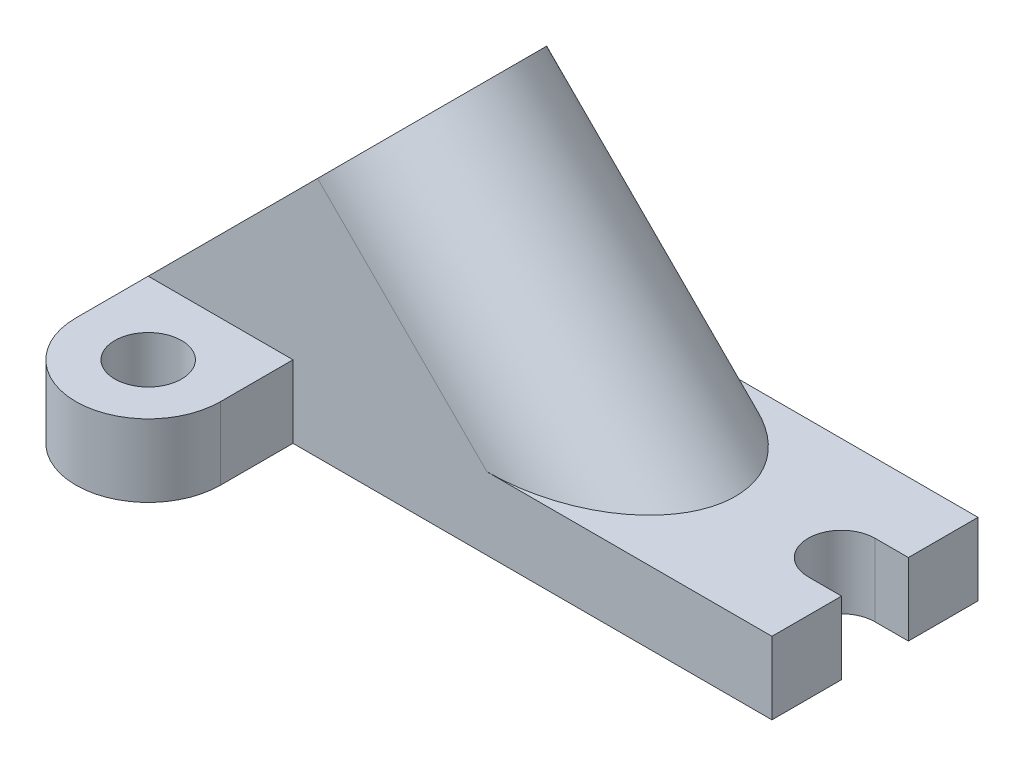
ISO-10303-21;
HEADER;
FILE_DESCRIPTION(('STEP AP214'),'2;1');
FILE_NAME('part.step','',(''),(''),'','','');
FILE_SCHEMA(('AUTOMOTIVE_DESIGN { 1 0 10303 214 1 1 1 1 }'));
ENDSEC;
DATA;
#1=APPLICATION_CONTEXT('core data for automotive mechanical design processes');
#2=APPLICATION_PROTOCOL_DEFINITION('international standard','automotive_design',2000,#1);
#3=PRODUCT_CONTEXT('',#1,'mechanical');
#4=PRODUCT('Part','Part','',(#3));
#5=PRODUCT_RELATED_PRODUCT_CATEGORY('part','',(#4));
#6=PRODUCT_DEFINITION_FORMATION('','',#4);
#7=PRODUCT_DEFINITION_CONTEXT('part definition',#1,'design');
#8=PRODUCT_DEFINITION('design','',#6,#7);
#9=PRODUCT_DEFINITION_SHAPE('','',#8);
#10=(LENGTH_UNIT() NAMED_UNIT(*) SI_UNIT(.MILLI.,.METRE.));
#11=(NAMED_UNIT(*) PLANE_ANGLE_UNIT() SI_UNIT($,.RADIAN.));
#12=(NAMED_UNIT(*) SI_UNIT($,.STERADIAN.) SOLID_ANGLE_UNIT());
#13=UNCERTAINTY_MEASURE_WITH_UNIT(LENGTH_MEASURE(1.E-05),#10,'distance_accuracy_value','');
#14=(GEOMETRIC_REPRESENTATION_CONTEXT(3) GLOBAL_UNCERTAINTY_ASSIGNED_CONTEXT((#13)) GLOBAL_UNIT_ASSIGNED_CONTEXT((#10,
#11,#12)) REPRESENTATION_CONTEXT('',''));
#15=CARTESIAN_POINT('',(0.,0.,0.));
#16=DIRECTION('',(0.,0.,1.));
#17=DIRECTION('',(1.,0.,0.));
#18=AXIS2_PLACEMENT_3D('',#15,#16,#17);
#19=CARTESIAN_POINT('',(0.,13.,-31.5));
#20=DIRECTION('',(0.,1.,0.));
#21=DIRECTION('',(0.,0.,1.));
#22=AXIS2_PLACEMENT_3D('',#19,#20,#21);
#23=PLANE('',#22);
#24=CARTESIAN_POINT('',(47.8111831820432,13.,0.));
#25=DIRECTION('',(0.,1.,0.));
#26=DIRECTION('',(-1.,0.,0.));
#27=AXIS2_PLACEMENT_3D('',#24,#25,#26);
#28=ELLIPSE('',#27,26.1629509039023,18.5);
#29=CARTESIAN_POINT('',(47.8111831820432,13.,18.5));
#30=VERTEX_POINT('',#29);
#31=CARTESIAN_POINT('',(47.8111831820432,13.,-18.5));
#32=VERTEX_POINT('',#31);
#33=EDGE_CURVE('E56',#30,#32,#28,.T.);
#34=ORIENTED_EDGE('',*,*,#33,.F.);
#35=DIRECTION('',(-1.,0.,0.));
#36=VECTOR('',#35,1.);
#37=CARTESIAN_POINT('',(99.,13.,18.5));
#38=LINE('',#37,#36);
#39=CARTESIAN_POINT('',(99.,13.,18.5));
#40=VERTEX_POINT('',#39);
#41=EDGE_CURVE('E205',#40,#30,#38,.T.);
#42=ORIENTED_EDGE('',*,*,#41,.F.);
#43=DIRECTION('',(0.,0.,-1.));
#44=VECTOR('',#43,1.);
#45=CARTESIAN_POINT('',(99.,13.,18.5));
#46=LINE('',#45,#44);
#47=CARTESIAN_POINT('',(99.,13.,6.));
#48=VERTEX_POINT('',#47);
#49=EDGE_CURVE('E197',#40,#48,#46,.T.);
#50=ORIENTED_EDGE('',*,*,#49,.T.);
#51=DIRECTION('',(1.,0.,0.));
#52=VECTOR('',#51,1.);
#53=CARTESIAN_POINT('',(105.,13.,6.));
#54=LINE('',#53,#52);
#55=CARTESIAN_POINT('',(93.,13.,6.));
#56=VERTEX_POINT('',#55);
#57=EDGE_CURVE('E204',#56,#48,#54,.T.);
#58=ORIENTED_EDGE('',*,*,#57,.F.);
#59=CARTESIAN_POINT('',(93.,13.,0.));
#60=DIRECTION('',(0.,1.,0.));
#61=DIRECTION('',(0.,0.,1.));
#62=AXIS2_PLACEMENT_3D('',#59,#60,#61);
#63=CIRCLE('',#62,6.);
#64=CARTESIAN_POINT('',(93.,13.,-6.));
#65=VERTEX_POINT('',#64);
#66=EDGE_CURVE('E287',#65,#56,#63,.T.);
#67=ORIENTED_EDGE('',*,*,#66,.F.);
#68=DIRECTION('',(-1.,0.,0.));
#69=VECTOR('',#68,1.);
#70=CARTESIAN_POINT('',(105.,13.,-6.));
#71=LINE('',#70,#69);
#72=CARTESIAN_POINT('',(99.,13.,-6.));
#73=VERTEX_POINT('',#72);
#74=EDGE_CURVE('E284',#73,#65,#71,.T.);
#75=ORIENTED_EDGE('',*,*,#74,.F.);
#76=CARTESIAN_POINT('',(99.,13.,-18.5));
#77=VERTEX_POINT('',#76);
#78=EDGE_CURVE('E208',#73,#77,#46,.T.);
#79=ORIENTED_EDGE('',*,*,#78,.T.);
#80=DIRECTION('',(-1.,0.,0.));
#81=VECTOR('',#80,1.);
#82=CARTESIAN_POINT('',(99.,13.,-18.5));
#83=LINE('',#82,#81);
#84=EDGE_CURVE('E161',#77,#32,#83,.T.);
#85=ORIENTED_EDGE('',*,*,#84,.T.);
#86=EDGE_LOOP('',(#34,#42,#50,#58,#67,#75,#79,#85));
#87=FACE_BOUND('',#86,.T.);
#88=ADVANCED_FACE('F33',(#87),#23,.T.);
#89=DIRECTION('',(1.,0.,0.));
#90=VECTOR('',#89,1.);
#91=CARTESIAN_POINT('',(0.,13.,18.5));
#92=LINE('',#91,#90);
#93=CARTESIAN_POINT('',(-13.,13.,18.5));
#94=VERTEX_POINT('',#93);
#95=CARTESIAN_POINT('',(13.,13.,18.5));
#96=VERTEX_POINT('',#95);
#97=EDGE_CURVE('E252',#94,#96,#92,.T.);
#98=ORIENTED_EDGE('',*,*,#97,.F.);
#99=DIRECTION('',(0.,0.,1.));
#100=VECTOR('',#99,1.);
#101=CARTESIAN_POINT('',(-13.,13.,-31.5));
#102=LINE('',#101,#100);
#103=CARTESIAN_POINT('',(-13.,13.,31.5));
#104=VERTEX_POINT('',#103);
#105=EDGE_CURVE('E225',#94,#104,#102,.T.);
#106=ORIENTED_EDGE('',*,*,#105,.T.);
#107=CARTESIAN_POINT('',(0.,13.,31.5));
#108=DIRECTION('',(0.,1.,0.));
#109=DIRECTION('',(0.,0.,1.));
#110=AXIS2_PLACEMENT_3D('',#107,#108,#109);
#111=CIRCLE('',#110,13.);
#112=CARTESIAN_POINT('',(13.,13.,31.5));
#113=VERTEX_POINT('',#112);
#114=EDGE_CURVE('E228',#104,#113,#111,.T.);
#115=ORIENTED_EDGE('',*,*,#114,.T.);
#116=DIRECTION('',(0.,0.,-1.));
#117=VECTOR('',#116,1.);
#118=CARTESIAN_POINT('',(13.,13.,-31.5));
#119=LINE('',#118,#117);
#120=EDGE_CURVE('E179',#113,#96,#119,.T.);
#121=ORIENTED_EDGE('',*,*,#120,.T.);
#122=EDGE_LOOP('',(#98,#106,#115,#121));
#123=FACE_BOUND('',#122,.T.);
#124=CARTESIAN_POINT('',(0.,13.,31.5));
#125=DIRECTION('',(0.,1.,0.));
#126=DIRECTION('',(0.,0.,1.));
#127=AXIS2_PLACEMENT_3D('',#124,#125,#126);
#128=CIRCLE('',#127,6.);
#129=CARTESIAN_POINT('',(0.,13.,25.5));
#130=VERTEX_POINT('',#129);
#131=EDGE_CURVE('E211',#130,#130,#128,.T.);
#132=ORIENTED_EDGE('',*,*,#131,.F.);
#133=EDGE_LOOP('',(#132));
#134=FACE_BOUND('',#133,.T.);
#135=ADVANCED_FACE('F329',(#123,#134),#23,.T.);
#136=CARTESIAN_POINT('',(99.,0.,18.5));
#137=DIRECTION('',(-1.,0.,0.));
#138=DIRECTION('',(0.,0.,1.));
#139=AXIS2_PLACEMENT_3D('',#136,#137,#138);
#140=PLANE('',#139);
#141=DIRECTION('',(0.,0.,-1.));
#142=VECTOR('',#141,1.);
#143=CARTESIAN_POINT('',(99.,0.,18.5));
#144=LINE('',#143,#142);
#145=CARTESIAN_POINT('',(99.,0.,18.5));
#146=VERTEX_POINT('',#145);
#147=CARTESIAN_POINT('',(99.,0.,6.));
#148=VERTEX_POINT('',#147);
#149=EDGE_CURVE('E199',#146,#148,#144,.T.);
#150=ORIENTED_EDGE('',*,*,#149,.T.);
#151=DIRECTION('',(0.,1.,0.));
#152=VECTOR('',#151,1.);
#153=CARTESIAN_POINT('',(99.,0.,6.));
#154=LINE('',#153,#152);
#155=EDGE_CURVE('E41',#148,#48,#154,.T.);
#156=ORIENTED_EDGE('',*,*,#155,.T.);
#157=ORIENTED_EDGE('',*,*,#49,.F.);
#158=DIRECTION('',(0.,1.,0.));
#159=VECTOR('',#158,1.);
#160=CARTESIAN_POINT('',(99.,0.,18.5));
#161=LINE('',#160,#159);
#162=EDGE_CURVE('E152',#146,#40,#161,.T.);
#163=ORIENTED_EDGE('',*,*,#162,.F.);
#164=EDGE_LOOP('',(#150,#156,#157,#163));
#165=FACE_BOUND('',#164,.T.);
#166=ADVANCED_FACE('F195',(#165),#140,.F.);
#167=CARTESIAN_POINT('',(13.,13.,-31.5));
#168=DIRECTION('',(-1.,0.,0.));
#169=DIRECTION('',(0.,0.,1.));
#170=AXIS2_PLACEMENT_3D('',#167,#168,#169);
#171=PLANE('',#170);
#172=DIRECTION('',(0.,-1.,0.));
#173=VECTOR('',#172,1.);
#174=CARTESIAN_POINT('',(13.,13.,-18.5));
#175=LINE('',#174,#173);
#176=CARTESIAN_POINT('',(13.,13.,-18.5));
#177=VERTEX_POINT('',#176);
#178=CARTESIAN_POINT('',(13.,0.,-18.5));
#179=VERTEX_POINT('',#178);
#180=EDGE_CURVE('E144',#177,#179,#175,.T.);
#181=ORIENTED_EDGE('',*,*,#180,.T.);
#182=DIRECTION('',(0.,0.,-1.));
#183=VECTOR('',#182,1.);
#184=CARTESIAN_POINT('',(13.,0.,-31.5));
#185=LINE('',#184,#183);
#186=CARTESIAN_POINT('',(13.,0.,-31.5));
#187=VERTEX_POINT('',#186);
#188=EDGE_CURVE('E158',#179,#187,#185,.T.);
#189=ORIENTED_EDGE('',*,*,#188,.T.);
#190=DIRECTION('',(0.,-1.,0.));
#191=VECTOR('',#190,1.);
#192=CARTESIAN_POINT('',(13.,13.,-31.5));
#193=LINE('',#192,#191);
#194=CARTESIAN_POINT('',(13.,13.,-31.5));
#195=VERTEX_POINT('',#194);
#196=EDGE_CURVE('E176',#195,#187,#193,.T.);
#197=ORIENTED_EDGE('',*,*,#196,.F.);
#198=EDGE_CURVE('E160',#177,#195,#119,.T.);
#199=ORIENTED_EDGE('',*,*,#198,.F.);
#200=EDGE_LOOP('',(#181,#189,#197,#199));
#201=FACE_BOUND('',#200,.T.);
#202=ADVANCED_FACE('F156',(#201),#171,.F.);
#203=DIRECTION('',(-1.,0.,0.));
#204=VECTOR('',#203,1.);
#205=CARTESIAN_POINT('',(0.,13.,-18.5));
#206=LINE('',#205,#204);
#207=CARTESIAN_POINT('',(-13.,13.,-18.5));
#208=VERTEX_POINT('',#207);
#209=EDGE_CURVE('E282',#177,#208,#206,.T.);
#210=ORIENTED_EDGE('',*,*,#209,.F.);
#211=ORIENTED_EDGE('',*,*,#198,.T.);
#212=CARTESIAN_POINT('',(0.,13.,-31.5));
#213=DIRECTION('',(0.,1.,0.));
#214=DIRECTION('',(0.,0.,1.));
#215=AXIS2_PLACEMENT_3D('',#212,#213,#214);
#216=CIRCLE('',#215,13.);
#217=CARTESIAN_POINT('',(-13.,13.,-31.5));
#218=VERTEX_POINT('',#217);
#219=EDGE_CURVE('E171',#195,#218,#216,.T.);
#220=ORIENTED_EDGE('',*,*,#219,.T.);
#221=EDGE_CURVE('E226',#218,#208,#102,.T.);
#222=ORIENTED_EDGE('',*,*,#221,.T.);
#223=EDGE_LOOP('',(#210,#211,#220,#222));
#224=FACE_BOUND('',#223,.T.);
#225=CARTESIAN_POINT('',(0.,13.,-31.5));
#226=DIRECTION('',(0.,1.,0.));
#227=DIRECTION('',(0.,0.,1.));
#228=AXIS2_PLACEMENT_3D('',#225,#226,#227);
#229=CIRCLE('',#228,6.);
#230=CARTESIAN_POINT('',(0.,13.,-37.5));
#231=VERTEX_POINT('',#230);
#232=EDGE_CURVE('E218',#231,#231,#229,.T.);
#233=ORIENTED_EDGE('',*,*,#232,.F.);
#234=EDGE_LOOP('',(#233));
#235=FACE_BOUND('',#234,.T.);
#236=ADVANCED_FACE('F331',(#224,#235),#23,.T.);
#237=CARTESIAN_POINT('',(0.,0.,-31.5));
#238=DIRECTION('',(0.,1.,0.));
#239=DIRECTION('',(0.,0.,1.));
#240=AXIS2_PLACEMENT_3D('',#237,#238,#239);
#241=PLANE('',#240);
#242=CARTESIAN_POINT('',(60.8111831820433,0.,0.));
#243=DIRECTION('',(0.,1.,0.));
#244=DIRECTION('',(-1.,0.,0.));
#245=AXIS2_PLACEMENT_3D('',#242,#243,#244);
#246=ELLIPSE('',#245,11.3137084989848,7.99999999999999);
#247=CARTESIAN_POINT('',(49.4974746830585,0.,0.));
#248=VERTEX_POINT('',#247);
#249=EDGE_CURVE('E308',#248,#248,#246,.T.);
#250=ORIENTED_EDGE('',*,*,#249,.T.);
#251=EDGE_LOOP('',(#250));
#252=FACE_BOUND('',#251,.T.);
#253=CARTESIAN_POINT('',(0.,0.,-31.5));
#254=DIRECTION('',(0.,1.,0.));
#255=DIRECTION('',(0.,0.,1.));
#256=AXIS2_PLACEMENT_3D('',#253,#254,#255);
#257=CIRCLE('',#256,6.);
#258=CARTESIAN_POINT('',(0.,0.,-37.5));
#259=VERTEX_POINT('',#258);
#260=EDGE_CURVE('E216',#259,#259,#257,.T.);
#261=ORIENTED_EDGE('',*,*,#260,.T.);
#262=EDGE_LOOP('',(#261));
#263=FACE_BOUND('',#262,.T.);
#264=CARTESIAN_POINT('',(0.,0.,31.5));
#265=DIRECTION('',(0.,1.,0.));
#266=DIRECTION('',(0.,0.,1.));
#267=AXIS2_PLACEMENT_3D('',#264,#265,#266);
#268=CIRCLE('',#267,6.);
#269=CARTESIAN_POINT('',(0.,0.,25.5));
#270=VERTEX_POINT('',#269);
#271=EDGE_CURVE('E207',#270,#270,#268,.T.);
#272=ORIENTED_EDGE('',*,*,#271,.T.);
#273=EDGE_LOOP('',(#272));
#274=FACE_BOUND('',#273,.T.);
#275=DIRECTION('',(1.,0.,0.));
#276=VECTOR('',#275,1.);
#277=CARTESIAN_POINT('',(13.,0.,18.5));
#278=LINE('',#277,#276);
#279=CARTESIAN_POINT('',(13.,0.,18.5));
#280=VERTEX_POINT('',#279);
#281=EDGE_CURVE('E241',#280,#146,#278,.T.);
#282=ORIENTED_EDGE('',*,*,#281,.F.);
#283=CARTESIAN_POINT('',(13.,0.,31.5));
#284=VERTEX_POINT('',#283);
#285=EDGE_CURVE('E167',#284,#280,#185,.T.);
#286=ORIENTED_EDGE('',*,*,#285,.F.);
#287=CARTESIAN_POINT('',(0.,0.,31.5));
#288=DIRECTION('',(0.,1.,0.));
#289=DIRECTION('',(0.,0.,1.));
#290=AXIS2_PLACEMENT_3D('',#287,#288,#289);
#291=CIRCLE('',#290,13.);
#292=CARTESIAN_POINT('',(-13.,0.,31.5));
#293=VERTEX_POINT('',#292);
#294=EDGE_CURVE('E168',#293,#284,#291,.T.);
#295=ORIENTED_EDGE('',*,*,#294,.F.);
#296=DIRECTION('',(0.,0.,1.));
#297=VECTOR('',#296,1.);
#298=CARTESIAN_POINT('',(-13.,0.,-31.5));
#299=LINE('',#298,#297);
#300=CARTESIAN_POINT('',(-13.,0.,-31.5));
#301=VERTEX_POINT('',#300);
#302=EDGE_CURVE('E172',#301,#293,#299,.T.);
#303=ORIENTED_EDGE('',*,*,#302,.F.);
#304=CARTESIAN_POINT('',(0.,0.,-31.5));
#305=DIRECTION('',(0.,1.,0.));
#306=DIRECTION('',(0.,0.,1.));
#307=AXIS2_PLACEMENT_3D('',#304,#305,#306);
#308=CIRCLE('',#307,13.);
#309=EDGE_CURVE('E166',#187,#301,#308,.T.);
#310=ORIENTED_EDGE('',*,*,#309,.F.);
#311=ORIENTED_EDGE('',*,*,#188,.F.);
#312=DIRECTION('',(1.,0.,0.));
#313=VECTOR('',#312,1.);
#314=CARTESIAN_POINT('',(13.,0.,-18.5));
#315=LINE('',#314,#313);
#316=CARTESIAN_POINT('',(99.,0.,-18.5));
#317=VERTEX_POINT('',#316);
#318=EDGE_CURVE('E140',#179,#317,#315,.T.);
#319=ORIENTED_EDGE('',*,*,#318,.T.);
#320=CARTESIAN_POINT('',(99.,0.,-5.99999999999999));
#321=VERTEX_POINT('',#320);
#322=EDGE_CURVE('E254',#321,#317,#144,.T.);
#323=ORIENTED_EDGE('',*,*,#322,.F.);
#324=DIRECTION('',(-1.,0.,0.));
#325=VECTOR('',#324,1.);
#326=CARTESIAN_POINT('',(0.,0.,-6.));
#327=LINE('',#326,#325);
#328=CARTESIAN_POINT('',(93.,0.,-6.));
#329=VERTEX_POINT('',#328);
#330=EDGE_CURVE('E294',#321,#329,#327,.T.);
#331=ORIENTED_EDGE('',*,*,#330,.T.);
#332=CARTESIAN_POINT('',(93.,0.,0.));
#333=DIRECTION('',(0.,1.,0.));
#334=DIRECTION('',(0.,0.,1.));
#335=AXIS2_PLACEMENT_3D('',#332,#333,#334);
#336=CIRCLE('',#335,6.);
#337=CARTESIAN_POINT('',(93.,0.,6.));
#338=VERTEX_POINT('',#337);
#339=EDGE_CURVE('E11',#329,#338,#336,.T.);
#340=ORIENTED_EDGE('',*,*,#339,.T.);
#341=DIRECTION('',(1.,0.,0.));
#342=VECTOR('',#341,1.);
#343=CARTESIAN_POINT('',(0.,0.,6.00000000000001));
#344=LINE('',#343,#342);
#345=EDGE_CURVE('E260',#338,#148,#344,.T.);
#346=ORIENTED_EDGE('',*,*,#345,.T.);
#347=ORIENTED_EDGE('',*,*,#149,.F.);
#348=EDGE_LOOP('',(#282,#286,#295,#303,#310,#311,#319,#323,#331,#340,#346,#347));
#349=FACE_BOUND('',#348,.T.);
#350=ADVANCED_FACE('F164',(#252,#263,#274,#349),#241,.F.);
#351=CARTESIAN_POINT('',(0.,13.,-31.5));
#352=DIRECTION('',(0.,-1.,0.));
#353=DIRECTION('',(0.,0.,-1.));
#354=AXIS2_PLACEMENT_3D('',#351,#352,#353);
#355=CYLINDRICAL_SURFACE('',#354,13.);
#356=ORIENTED_EDGE('',*,*,#309,.T.);
#357=DIRECTION('',(0.,-1.,0.));
#358=VECTOR('',#357,1.);
#359=CARTESIAN_POINT('',(-13.,13.,-31.5));
#360=LINE('',#359,#358);
#361=EDGE_CURVE('E185',#218,#301,#360,.T.);
#362=ORIENTED_EDGE('',*,*,#361,.F.);
#363=ORIENTED_EDGE('',*,*,#219,.F.);
#364=ORIENTED_EDGE('',*,*,#196,.T.);
#365=EDGE_LOOP('',(#356,#362,#363,#364));
#366=FACE_BOUND('',#365,.T.);
#367=ADVANCED_FACE('F35',(#366),#355,.T.);
#368=CARTESIAN_POINT('',(-13.,13.,-31.5));
#369=DIRECTION('',(1.,0.,0.));
#370=DIRECTION('',(0.,0.,-1.));
#371=AXIS2_PLACEMENT_3D('',#368,#369,#370);
#372=PLANE('',#371);
#373=ORIENTED_EDGE('',*,*,#302,.T.);
#374=DIRECTION('',(0.,-1.,0.));
#375=VECTOR('',#374,1.);
#376=CARTESIAN_POINT('',(-13.,13.,31.5));
#377=LINE('',#376,#375);
#378=EDGE_CURVE('E182',#104,#293,#377,.T.);
#379=ORIENTED_EDGE('',*,*,#378,.F.);
#380=ORIENTED_EDGE('',*,*,#105,.F.);
#381=DIRECTION('',(0.,0.,1.));
#382=VECTOR('',#381,1.);
#383=CARTESIAN_POINT('',(-13.,13.,18.5));
#384=LINE('',#383,#382);
#385=EDGE_CURVE('E48',#208,#94,#384,.T.);
#386=ORIENTED_EDGE('',*,*,#385,.F.);
#387=ORIENTED_EDGE('',*,*,#221,.F.);
#388=ORIENTED_EDGE('',*,*,#361,.T.);
#389=EDGE_LOOP('',(#373,#379,#380,#386,#387,#388));
#390=FACE_BOUND('',#389,.T.);
#391=ADVANCED_FACE('F233',(#390),#372,.F.);
#392=CARTESIAN_POINT('',(0.,13.,31.5));
#393=DIRECTION('',(0.,-1.,0.));
#394=DIRECTION('',(0.,0.,-1.));
#395=AXIS2_PLACEMENT_3D('',#392,#393,#394);
#396=CYLINDRICAL_SURFACE('',#395,13.);
#397=ORIENTED_EDGE('',*,*,#294,.T.);
#398=DIRECTION('',(0.,-1.,0.));
#399=VECTOR('',#398,1.);
#400=CARTESIAN_POINT('',(13.,13.,31.5));
#401=LINE('',#400,#399);
#402=EDGE_CURVE('E178',#113,#284,#401,.T.);
#403=ORIENTED_EDGE('',*,*,#402,.F.);
#404=ORIENTED_EDGE('',*,*,#114,.F.);
#405=ORIENTED_EDGE('',*,*,#378,.T.);
#406=EDGE_LOOP('',(#397,#403,#404,#405));
#407=FACE_BOUND('',#406,.T.);
#408=ADVANCED_FACE('F238',(#407),#396,.T.);
#409=ORIENTED_EDGE('',*,*,#285,.T.);
#410=DIRECTION('',(0.,-1.,0.));
#411=VECTOR('',#410,1.);
#412=CARTESIAN_POINT('',(13.,13.,18.5));
#413=LINE('',#412,#411);
#414=EDGE_CURVE('E246',#96,#280,#413,.T.);
#415=ORIENTED_EDGE('',*,*,#414,.F.);
#416=ORIENTED_EDGE('',*,*,#120,.F.);
#417=ORIENTED_EDGE('',*,*,#402,.T.);
#418=EDGE_LOOP('',(#409,#415,#416,#417));
#419=FACE_BOUND('',#418,.T.);
#420=ADVANCED_FACE('F244',(#419),#171,.F.);
#421=CARTESIAN_POINT('',(0.,13.,-31.5));
#422=DIRECTION('',(0.,-1.,0.));
#423=DIRECTION('',(0.,0.,-1.));
#424=AXIS2_PLACEMENT_3D('',#421,#422,#423);
#425=CYLINDRICAL_SURFACE('',#424,6.);
#426=CARTESIAN_POINT('',(0.,13.,-37.5));
#427=CARTESIAN_POINT('',(0.,12.8645833333333,-37.5));
#428=CARTESIAN_POINT('',(0.,12.7291666666667,-37.5));
#429=CARTESIAN_POINT('',(0.,12.4583333333333,-37.5));
#430=CARTESIAN_POINT('',(0.,12.3229166666667,-37.5));
#431=CARTESIAN_POINT('',(0.,12.0520833333333,-37.5));
#432=CARTESIAN_POINT('',(0.,11.9166666666667,-37.5));
#433=CARTESIAN_POINT('',(0.,11.6458333333333,-37.5));
#434=CARTESIAN_POINT('',(0.,11.5104166666667,-37.5));
#435=CARTESIAN_POINT('',(0.,11.2395833333333,-37.5));
#436=CARTESIAN_POINT('',(0.,11.1041666666667,-37.5));
#437=CARTESIAN_POINT('',(0.,10.8333333333333,-37.5));
#438=CARTESIAN_POINT('',(0.,10.6979166666667,-37.5));
#439=CARTESIAN_POINT('',(0.,10.4270833333333,-37.5));
#440=CARTESIAN_POINT('',(0.,10.2916666666667,-37.5));
#441=CARTESIAN_POINT('',(0.,10.0208333333333,-37.5));
#442=CARTESIAN_POINT('',(0.,9.88541666666667,-37.5));
#443=CARTESIAN_POINT('',(0.,9.61458333333333,-37.5));
#444=CARTESIAN_POINT('',(0.,9.47916666666667,-37.5));
#445=CARTESIAN_POINT('',(0.,9.20833333333333,-37.5));
#446=CARTESIAN_POINT('',(0.,9.07291666666666,-37.5));
#447=CARTESIAN_POINT('',(0.,8.80208333333333,-37.5));
#448=CARTESIAN_POINT('',(0.,8.66666666666667,-37.5));
#449=CARTESIAN_POINT('',(0.,8.39583333333333,-37.5));
#450=CARTESIAN_POINT('',(0.,8.26041666666667,-37.5));
#451=CARTESIAN_POINT('',(0.,7.98958333333333,-37.5));
#452=CARTESIAN_POINT('',(0.,7.85416666666667,-37.5));
#453=CARTESIAN_POINT('',(0.,7.58333333333333,-37.5));
#454=CARTESIAN_POINT('',(0.,7.44791666666667,-37.5));
#455=CARTESIAN_POINT('',(0.,7.17708333333333,-37.5));
#456=CARTESIAN_POINT('',(0.,7.04166666666667,-37.5));
#457=CARTESIAN_POINT('',(0.,6.77083333333333,-37.5));
#458=CARTESIAN_POINT('',(0.,6.63541666666667,-37.5));
#459=CARTESIAN_POINT('',(0.,6.36458333333333,-37.5));
#460=CARTESIAN_POINT('',(0.,6.22916666666667,-37.5));
#461=CARTESIAN_POINT('',(0.,5.95833333333333,-37.5));
#462=CARTESIAN_POINT('',(0.,5.82291666666667,-37.5));
#463=CARTESIAN_POINT('',(0.,5.55208333333333,-37.5));
#464=CARTESIAN_POINT('',(0.,5.41666666666667,-37.5));
#465=CARTESIAN_POINT('',(0.,5.14583333333333,-37.5));
#466=CARTESIAN_POINT('',(0.,5.01041666666667,-37.5));
#467=CARTESIAN_POINT('',(0.,4.73958333333333,-37.5));
#468=CARTESIAN_POINT('',(0.,4.60416666666667,-37.5));
#469=CARTESIAN_POINT('',(0.,4.33333333333333,-37.5));
#470=CARTESIAN_POINT('',(0.,4.19791666666667,-37.5));
#471=CARTESIAN_POINT('',(0.,3.92708333333333,-37.5));
#472=CARTESIAN_POINT('',(0.,3.79166666666667,-37.5));
#473=CARTESIAN_POINT('',(0.,3.52083333333333,-37.5));
#474=CARTESIAN_POINT('',(0.,3.38541666666667,-37.5));
#475=CARTESIAN_POINT('',(0.,3.11458333333333,-37.5));
#476=CARTESIAN_POINT('',(0.,2.97916666666667,-37.5));
#477=CARTESIAN_POINT('',(0.,2.70833333333333,-37.5));
#478=CARTESIAN_POINT('',(0.,2.57291666666667,-37.5));
#479=CARTESIAN_POINT('',(0.,2.30208333333333,-37.5));
#480=CARTESIAN_POINT('',(0.,2.16666666666667,-37.5));
#481=CARTESIAN_POINT('',(0.,1.89583333333333,-37.5));
#482=CARTESIAN_POINT('',(0.,1.76041666666667,-37.5));
#483=CARTESIAN_POINT('',(0.,1.48958333333333,-37.5));
#484=CARTESIAN_POINT('',(0.,1.35416666666667,-37.5));
#485=CARTESIAN_POINT('',(0.,1.08333333333333,-37.5));
#486=CARTESIAN_POINT('',(0.,0.947916666666667,-37.5));
#487=CARTESIAN_POINT('',(0.,0.677083333333334,-37.5));
#488=CARTESIAN_POINT('',(0.,0.541666666666667,-37.5));
#489=CARTESIAN_POINT('',(0.,0.270833333333334,-37.5));
#490=CARTESIAN_POINT('',(0.,0.135416666666667,-37.5));
#491=CARTESIAN_POINT('',(0.,0.,-37.5));
#492=B_SPLINE_CURVE_WITH_KNOTS('',3,(#426,#427,#428,#429,#430,#431,#432,#433,#434,#435,#436,
#437,#438,#439,#440,#441,#442,#443,#444,#445,#446,#447,#448,#449,#450,#451,#452,#453,#454,#455,
#456,#457,#458,#459,#460,#461,#462,#463,#464,#465,#466,#467,#468,#469,#470,#471,#472,#473,#474,
#475,#476,#477,#478,#479,#480,#481,#482,#483,#484,#485,#486,#487,#488,#489,#490,#491),
.UNSPECIFIED.,.F.,.F.,(4,2,2,2,2,2,2,2,2,2,2,2,2,2,2,2,2,2,2,2,2,2,2,2,2,2,2,2,2,2,2,2,4),(0.,
0.40625,0.812500000000001,1.21875,1.625,2.03125,2.4375,2.84375,3.25,3.65625,4.0625,4.46875,
4.875,5.28125,5.6875,6.09375,6.5,6.90625,7.3125,7.71875,8.125,8.53125,8.9375,9.34375,9.75,
10.15625,10.5625,10.96875,11.375,11.78125,12.1875,12.59375,13.),.UNSPECIFIED.);
#493=EDGE_CURVE('BSEAM348',#231,#259,#492,.T.);
#494=ORIENTED_EDGE('',*,*,#232,.T.);
#495=ORIENTED_EDGE('',*,*,#260,.F.);
#496=ORIENTED_EDGE('',*,*,#493,.T.);
#497=ORIENTED_EDGE('',*,*,#493,.F.);
#498=EDGE_LOOP('',(#494,#496,#495,#497));
#499=FACE_BOUND('',#498,.T.);
#500=ADVANCED_FACE('F348',(#499),#425,.F.);
#501=CARTESIAN_POINT('',(0.,13.,31.5));
#502=DIRECTION('',(0.,-1.,0.));
#503=DIRECTION('',(0.,0.,-1.));
#504=AXIS2_PLACEMENT_3D('',#501,#502,#503);
#505=CYLINDRICAL_SURFACE('',#504,6.);
#506=CARTESIAN_POINT('',(0.,13.,25.5));
#507=CARTESIAN_POINT('',(0.,12.8645833333333,25.5));
#508=CARTESIAN_POINT('',(0.,12.7291666666667,25.5));
#509=CARTESIAN_POINT('',(0.,12.4583333333333,25.5));
#510=CARTESIAN_POINT('',(0.,12.3229166666667,25.5));
#511=CARTESIAN_POINT('',(0.,12.0520833333333,25.5));
#512=CARTESIAN_POINT('',(0.,11.9166666666667,25.5));
#513=CARTESIAN_POINT('',(0.,11.6458333333333,25.5));
#514=CARTESIAN_POINT('',(0.,11.5104166666667,25.5));
#515=CARTESIAN_POINT('',(0.,11.2395833333333,25.5));
#516=CARTESIAN_POINT('',(0.,11.1041666666667,25.5));
#517=CARTESIAN_POINT('',(0.,10.8333333333333,25.5));
#518=CARTESIAN_POINT('',(0.,10.6979166666667,25.5));
#519=CARTESIAN_POINT('',(0.,10.4270833333333,25.5));
#520=CARTESIAN_POINT('',(0.,10.2916666666667,25.5));
#521=CARTESIAN_POINT('',(0.,10.0208333333333,25.5));
#522=CARTESIAN_POINT('',(0.,9.88541666666667,25.5));
#523=CARTESIAN_POINT('',(0.,9.61458333333333,25.5));
#524=CARTESIAN_POINT('',(0.,9.47916666666667,25.5));
#525=CARTESIAN_POINT('',(0.,9.20833333333333,25.5));
#526=CARTESIAN_POINT('',(0.,9.07291666666666,25.5));
#527=CARTESIAN_POINT('',(0.,8.80208333333333,25.5));
#528=CARTESIAN_POINT('',(0.,8.66666666666667,25.5));
#529=CARTESIAN_POINT('',(0.,8.39583333333333,25.5));
#530=CARTESIAN_POINT('',(0.,8.26041666666667,25.5));
#531=CARTESIAN_POINT('',(0.,7.98958333333333,25.5));
#532=CARTESIAN_POINT('',(0.,7.85416666666667,25.5));
#533=CARTESIAN_POINT('',(0.,7.58333333333333,25.5));
#534=CARTESIAN_POINT('',(0.,7.44791666666667,25.5));
#535=CARTESIAN_POINT('',(0.,7.17708333333333,25.5));
#536=CARTESIAN_POINT('',(0.,7.04166666666667,25.5));
#537=CARTESIAN_POINT('',(0.,6.77083333333333,25.5));
#538=CARTESIAN_POINT('',(0.,6.63541666666667,25.5));
#539=CARTESIAN_POINT('',(0.,6.36458333333333,25.5));
#540=CARTESIAN_POINT('',(0.,6.22916666666667,25.5));
#541=CARTESIAN_POINT('',(0.,5.95833333333333,25.5));
#542=CARTESIAN_POINT('',(0.,5.82291666666667,25.5));
#543=CARTESIAN_POINT('',(0.,5.55208333333333,25.5));
#544=CARTESIAN_POINT('',(0.,5.41666666666667,25.5));
#545=CARTESIAN_POINT('',(0.,5.14583333333333,25.5));
#546=CARTESIAN_POINT('',(0.,5.01041666666667,25.5));
#547=CARTESIAN_POINT('',(0.,4.73958333333333,25.5));
#548=CARTESIAN_POINT('',(0.,4.60416666666667,25.5));
#549=CARTESIAN_POINT('',(0.,4.33333333333333,25.5));
#550=CARTESIAN_POINT('',(0.,4.19791666666667,25.5));
#551=CARTESIAN_POINT('',(0.,3.92708333333333,25.5));
#552=CARTESIAN_POINT('',(0.,3.79166666666667,25.5));
#553=CARTESIAN_POINT('',(0.,3.52083333333333,25.5));
#554=CARTESIAN_POINT('',(0.,3.38541666666667,25.5));
#555=CARTESIAN_POINT('',(0.,3.11458333333333,25.5));
#556=CARTESIAN_POINT('',(0.,2.97916666666667,25.5));
#557=CARTESIAN_POINT('',(0.,2.70833333333333,25.5));
#558=CARTESIAN_POINT('',(0.,2.57291666666667,25.5));
#559=CARTESIAN_POINT('',(0.,2.30208333333333,25.5));
#560=CARTESIAN_POINT('',(0.,2.16666666666667,25.5));
#561=CARTESIAN_POINT('',(0.,1.89583333333333,25.5));
#562=CARTESIAN_POINT('',(0.,1.76041666666667,25.5));
#563=CARTESIAN_POINT('',(0.,1.48958333333333,25.5));
#564=CARTESIAN_POINT('',(0.,1.35416666666667,25.5));
#565=CARTESIAN_POINT('',(0.,1.08333333333333,25.5));
#566=CARTESIAN_POINT('',(0.,0.947916666666667,25.5));
#567=CARTESIAN_POINT('',(0.,0.677083333333334,25.5));
#568=CARTESIAN_POINT('',(0.,0.541666666666667,25.5));
#569=CARTESIAN_POINT('',(0.,0.270833333333334,25.5));
#570=CARTESIAN_POINT('',(0.,0.135416666666667,25.5));
#571=CARTESIAN_POINT('',(0.,0.,25.5));
#572=B_SPLINE_CURVE_WITH_KNOTS('',3,(#506,#507,#508,#509,#510,#511,#512,#513,#514,#515,#516,
#517,#518,#519,#520,#521,#522,#523,#524,#525,#526,#527,#528,#529,#530,#531,#532,#533,#534,#535,
#536,#537,#538,#539,#540,#541,#542,#543,#544,#545,#546,#547,#548,#549,#550,#551,#552,#553,#554,
#555,#556,#557,#558,#559,#560,#561,#562,#563,#564,#565,#566,#567,#568,#569,#570,#571),
.UNSPECIFIED.,.F.,.F.,(4,2,2,2,2,2,2,2,2,2,2,2,2,2,2,2,2,2,2,2,2,2,2,2,2,2,2,2,2,2,2,2,4),(0.,
0.40625,0.812500000000001,1.21875,1.625,2.03125,2.4375,2.84375,3.25,3.65625,4.0625,4.46875,
4.875,5.28125,5.6875,6.09375,6.5,6.90625,7.3125,7.71875,8.125,8.53125,8.9375,9.34375,9.75,
10.15625,10.5625,10.96875,11.375,11.78125,12.1875,12.59375,13.),.UNSPECIFIED.);
#573=EDGE_CURVE('BSEAM351',#130,#270,#572,.T.);
#574=ORIENTED_EDGE('',*,*,#131,.T.);
#575=ORIENTED_EDGE('',*,*,#271,.F.);
#576=ORIENTED_EDGE('',*,*,#573,.T.);
#577=ORIENTED_EDGE('',*,*,#573,.F.);
#578=EDGE_LOOP('',(#574,#576,#575,#577));
#579=FACE_BOUND('',#578,.T.);
#580=ADVANCED_FACE('F351',(#579),#505,.F.);
#581=ORIENTED_EDGE('',*,*,#78,.F.);
#582=DIRECTION('',(0.,-1.,0.));
#583=VECTOR('',#582,1.);
#584=CARTESIAN_POINT('',(99.,0.,-5.99999999999999));
#585=LINE('',#584,#583);
#586=EDGE_CURVE('E188',#73,#321,#585,.T.);
#587=ORIENTED_EDGE('',*,*,#586,.T.);
#588=ORIENTED_EDGE('',*,*,#322,.T.);
#589=DIRECTION('',(0.,1.,0.));
#590=VECTOR('',#589,1.);
#591=CARTESIAN_POINT('',(99.,0.,-18.5));
#592=LINE('',#591,#590);
#593=EDGE_CURVE('E147',#317,#77,#592,.T.);
#594=ORIENTED_EDGE('',*,*,#593,.T.);
#595=EDGE_LOOP('',(#581,#587,#588,#594));
#596=FACE_BOUND('',#595,.T.);
#597=ADVANCED_FACE('F357',(#596),#140,.F.);
#598=CARTESIAN_POINT('',(0.,0.,18.5));
#599=DIRECTION('',(0.,0.,1.));
#600=DIRECTION('',(1.,0.,0.));
#601=AXIS2_PLACEMENT_3D('',#598,#599,#600);
#602=PLANE('',#601);
#603=ORIENTED_EDGE('',*,*,#414,.T.);
#604=ORIENTED_EDGE('',*,*,#281,.T.);
#605=ORIENTED_EDGE('',*,*,#162,.T.);
#606=ORIENTED_EDGE('',*,*,#41,.T.);
#607=DIRECTION('',(-0.707106781186549,0.707106781186546,0.));
#608=VECTOR('',#607,1.);
#609=CARTESIAN_POINT('',(62.6604255869606,-1.84924240491736,18.5));
#610=LINE('',#609,#608);
#611=CARTESIAN_POINT('',(17.4055915910215,43.4055915910216,18.5));
#612=VERTEX_POINT('',#611);
#613=EDGE_CURVE('E270',#30,#612,#610,.T.);
#614=ORIENTED_EDGE('',*,*,#613,.T.);
#615=DIRECTION('',(0.707106781186546,0.707106781186549,0.));
#616=VECTOR('',#615,1.);
#617=CARTESIAN_POINT('',(17.4055915910215,43.4055915910216,18.5));
#618=LINE('',#617,#616);
#619=EDGE_CURVE('E275',#94,#612,#618,.T.);
#620=ORIENTED_EDGE('',*,*,#619,.F.);
#621=ORIENTED_EDGE('',*,*,#97,.T.);
#622=EDGE_LOOP('',(#603,#604,#605,#606,#614,#620,#621));
#623=FACE_BOUND('',#622,.T.);
#624=ADVANCED_FACE('F249',(#623),#602,.T.);
#625=CARTESIAN_POINT('',(0.,0.,-18.5));
#626=DIRECTION('',(0.,0.,1.));
#627=DIRECTION('',(1.,0.,0.));
#628=AXIS2_PLACEMENT_3D('',#625,#626,#627);
#629=PLANE('',#628);
#630=ORIENTED_EDGE('',*,*,#318,.F.);
#631=ORIENTED_EDGE('',*,*,#180,.F.);
#632=ORIENTED_EDGE('',*,*,#209,.T.);
#633=DIRECTION('',(-0.707106781186546,-0.707106781186549,0.));
#634=VECTOR('',#633,1.);
#635=CARTESIAN_POINT('',(17.4055915910215,43.4055915910216,-18.5));
#636=LINE('',#635,#634);
#637=CARTESIAN_POINT('',(17.4055915910215,43.4055915910216,-18.5));
#638=VERTEX_POINT('',#637);
#639=EDGE_CURVE('E273',#638,#208,#636,.T.);
#640=ORIENTED_EDGE('',*,*,#639,.F.);
#641=DIRECTION('',(-0.707106781186549,0.707106781186546,0.));
#642=VECTOR('',#641,1.);
#643=CARTESIAN_POINT('',(62.6604255869606,-1.84924240491736,-18.5));
#644=LINE('',#643,#642);
#645=EDGE_CURVE('E268',#32,#638,#644,.T.);
#646=ORIENTED_EDGE('',*,*,#645,.F.);
#647=ORIENTED_EDGE('',*,*,#84,.F.);
#648=ORIENTED_EDGE('',*,*,#593,.F.);
#649=EDGE_LOOP('',(#630,#631,#632,#640,#646,#647,#648));
#650=FACE_BOUND('',#649,.T.);
#651=ADVANCED_FACE('F142',(#650),#629,.F.);
#652=CARTESIAN_POINT('',(93.,-24.,0.));
#653=DIRECTION('',(0.,1.,0.));
#654=DIRECTION('',(0.,0.,1.));
#655=AXIS2_PLACEMENT_3D('',#652,#653,#654);
#656=CYLINDRICAL_SURFACE('',#655,6.);
#657=DIRECTION('',(0.,1.,0.));
#658=VECTOR('',#657,1.);
#659=CARTESIAN_POINT('',(93.,-24.,-6.));
#660=LINE('',#659,#658);
#661=EDGE_CURVE('E291',#329,#65,#660,.T.);
#662=ORIENTED_EDGE('',*,*,#661,.T.);
#663=ORIENTED_EDGE('',*,*,#66,.T.);
#664=DIRECTION('',(0.,1.,0.));
#665=VECTOR('',#664,1.);
#666=CARTESIAN_POINT('',(93.,-24.,6.));
#667=LINE('',#666,#665);
#668=EDGE_CURVE('E292',#338,#56,#667,.T.);
#669=ORIENTED_EDGE('',*,*,#668,.F.);
#670=ORIENTED_EDGE('',*,*,#339,.F.);
#671=EDGE_LOOP('',(#662,#663,#669,#670));
#672=FACE_BOUND('',#671,.T.);
#673=ADVANCED_FACE('F368',(#672),#656,.F.);
#674=CARTESIAN_POINT('',(105.,-24.,6.));
#675=DIRECTION('',(0.,0.,1.));
#676=DIRECTION('',(1.,0.,0.));
#677=AXIS2_PLACEMENT_3D('',#674,#675,#676);
#678=PLANE('',#677);
#679=ORIENTED_EDGE('',*,*,#668,.T.);
#680=ORIENTED_EDGE('',*,*,#57,.T.);
#681=ORIENTED_EDGE('',*,*,#155,.F.);
#682=ORIENTED_EDGE('',*,*,#345,.F.);
#683=EDGE_LOOP('',(#679,#680,#681,#682));
#684=FACE_BOUND('',#683,.T.);
#685=ADVANCED_FACE('F325',(#684),#678,.F.);
#686=CARTESIAN_POINT('',(105.,-24.,-6.));
#687=DIRECTION('',(0.,0.,-1.));
#688=DIRECTION('',(-1.,0.,0.));
#689=AXIS2_PLACEMENT_3D('',#686,#687,#688);
#690=PLANE('',#689);
#691=ORIENTED_EDGE('',*,*,#586,.F.);
#692=ORIENTED_EDGE('',*,*,#74,.T.);
#693=ORIENTED_EDGE('',*,*,#661,.F.);
#694=ORIENTED_EDGE('',*,*,#330,.F.);
#695=EDGE_LOOP('',(#691,#692,#693,#694));
#696=FACE_BOUND('',#695,.T.);
#697=ADVANCED_FACE('F316',(#696),#690,.F.);
#698=CARTESIAN_POINT('',(62.6604255869606,-1.84924240491736,0.));
#699=DIRECTION('',(-0.707106781186549,0.707106781186546,0.));
#700=DIRECTION('',(-0.707106781186546,-0.707106781186549,0.));
#701=AXIS2_PLACEMENT_3D('',#698,#699,#700);
#702=CYLINDRICAL_SURFACE('',#701,8.);
#703=CARTESIAN_POINT('',(17.4055915910215,43.4055915910216,0.));
#704=DIRECTION('',(-0.707106781186549,0.707106781186546,0.));
#705=DIRECTION('',(-0.707106781186546,-0.707106781186549,0.));
#706=AXIS2_PLACEMENT_3D('',#703,#704,#705);
#707=CIRCLE('',#706,8.);
#708=CARTESIAN_POINT('',(11.7487373415291,37.7487373415292,0.));
#709=VERTEX_POINT('',#708);
#710=EDGE_CURVE('E300',#709,#709,#707,.T.);
#711=ORIENTED_EDGE('',*,*,#710,.T.);
#712=EDGE_LOOP('',(#711));
#713=FACE_BOUND('',#712,.T.);
#714=ORIENTED_EDGE('',*,*,#249,.F.);
#715=EDGE_LOOP('',(#714));
#716=FACE_BOUND('',#715,.T.);
#717=ADVANCED_FACE('F314',(#713,#716),#702,.F.);
#718=CARTESIAN_POINT('',(17.4055915910215,43.4055915910216,0.));
#719=DIRECTION('',(-0.707106781186549,0.707106781186546,0.));
#720=DIRECTION('',(-0.707106781186546,-0.707106781186549,0.));
#721=AXIS2_PLACEMENT_3D('',#718,#719,#720);
#722=PLANE('',#721);
#723=ORIENTED_EDGE('',*,*,#710,.F.);
#724=EDGE_LOOP('',(#723));
#725=FACE_BOUND('',#724,.T.);
#726=CARTESIAN_POINT('',(17.4055915910215,43.4055915910216,0.));
#727=DIRECTION('',(-0.707106781186549,0.707106781186546,0.));
#728=DIRECTION('',(-0.707106781186546,-0.707106781186549,0.));
#729=AXIS2_PLACEMENT_3D('',#726,#727,#728);
#730=CIRCLE('',#729,18.5);
#731=EDGE_CURVE('E298',#612,#638,#730,.T.);
#732=ORIENTED_EDGE('',*,*,#731,.T.);
#733=ORIENTED_EDGE('',*,*,#639,.T.);
#734=ORIENTED_EDGE('',*,*,#385,.T.);
#735=ORIENTED_EDGE('',*,*,#619,.T.);
#736=EDGE_LOOP('',(#732,#733,#734,#735));
#737=FACE_BOUND('',#736,.T.);
#738=ADVANCED_FACE('F302',(#725,#737),#722,.T.);
#739=CARTESIAN_POINT('',(62.6604255869606,-1.84924240491736,0.));
#740=DIRECTION('',(-0.707106781186549,0.707106781186546,0.));
#741=DIRECTION('',(-0.707106781186546,-0.707106781186549,0.));
#742=AXIS2_PLACEMENT_3D('',#739,#740,#741);
#743=CYLINDRICAL_SURFACE('',#742,18.5);
#744=ORIENTED_EDGE('',*,*,#613,.F.);
#745=ORIENTED_EDGE('',*,*,#33,.T.);
#746=ORIENTED_EDGE('',*,*,#645,.T.);
#747=ORIENTED_EDGE('',*,*,#731,.F.);
#748=EDGE_LOOP('',(#744,#745,#746,#747));
#749=FACE_BOUND('',#748,.T.);
#750=ADVANCED_FACE('F266',(#749),#743,.T.);
#751=CLOSED_SHELL('',(#88,#135,#166,#202,#236,#350,#367,#391,#408,#420,#500,#580,#597,#624,#651,
#673,#685,#697,#717,#738,#750));
#752=MANIFOLD_SOLID_BREP('B2',#751);
#753=ADVANCED_BREP_SHAPE_REPRESENTATION('',(#18,#752),#14);
#754=SHAPE_DEFINITION_REPRESENTATION(#9,#753);
ENDSEC;
END-ISO-10303-21;
